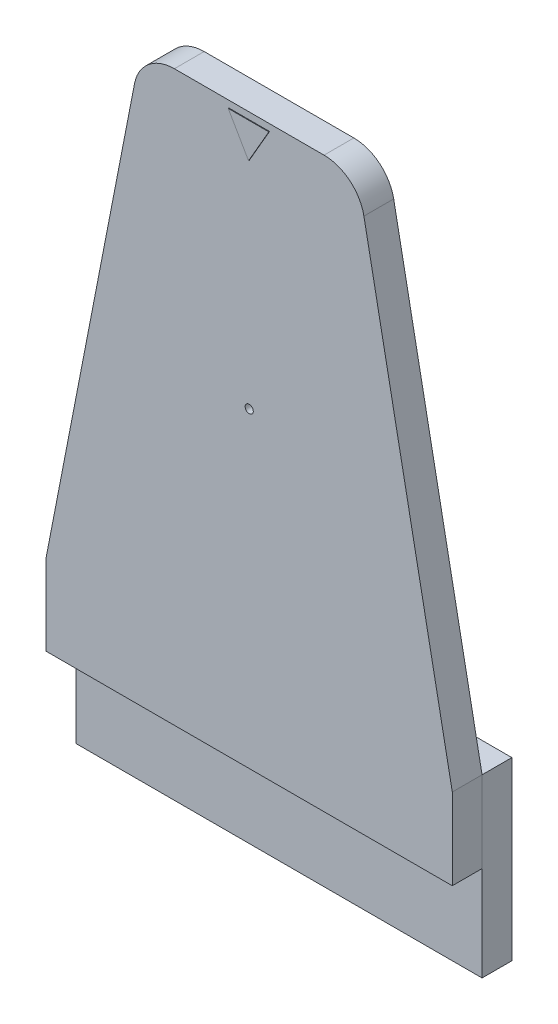
ISO-10303-21;
HEADER;
FILE_DESCRIPTION(('STEP AP214'),'2;1');
FILE_NAME('part.step','',(''),(''),'','','');
FILE_SCHEMA(('AUTOMOTIVE_DESIGN { 1 0 10303 214 1 1 1 1 }'));
ENDSEC;
DATA;
#1=APPLICATION_CONTEXT('core data for automotive mechanical design processes');
#2=APPLICATION_PROTOCOL_DEFINITION('international standard','automotive_design',2000,#1);
#3=PRODUCT_CONTEXT('',#1,'mechanical');
#4=PRODUCT('Part','Part','',(#3));
#5=PRODUCT_RELATED_PRODUCT_CATEGORY('part','',(#4));
#6=PRODUCT_DEFINITION_FORMATION('','',#4);
#7=PRODUCT_DEFINITION_CONTEXT('part definition',#1,'design');
#8=PRODUCT_DEFINITION('design','',#6,#7);
#9=PRODUCT_DEFINITION_SHAPE('','',#8);
#10=(LENGTH_UNIT() NAMED_UNIT(*) SI_UNIT(.MILLI.,.METRE.));
#11=(NAMED_UNIT(*) PLANE_ANGLE_UNIT() SI_UNIT($,.RADIAN.));
#12=(NAMED_UNIT(*) SI_UNIT($,.STERADIAN.) SOLID_ANGLE_UNIT());
#13=UNCERTAINTY_MEASURE_WITH_UNIT(LENGTH_MEASURE(1.E-05),#10,'distance_accuracy_value','');
#14=(GEOMETRIC_REPRESENTATION_CONTEXT(3) GLOBAL_UNCERTAINTY_ASSIGNED_CONTEXT((#13)) GLOBAL_UNIT_ASSIGNED_CONTEXT((#10,
#11,#12)) REPRESENTATION_CONTEXT('',''));
#15=CARTESIAN_POINT('',(0.,0.,0.));
#16=DIRECTION('',(0.,0.,1.));
#17=DIRECTION('',(1.,0.,0.));
#18=AXIS2_PLACEMENT_3D('',#15,#16,#17);
#19=CARTESIAN_POINT('',(0.,389.019237886467,22.5));
#20=DIRECTION('',(0.866025403784439,0.5,0.));
#21=DIRECTION('',(-0.5,0.866025403784439,0.));
#22=AXIS2_PLACEMENT_3D('',#19,#20,#21);
#23=PLANE('',#22);
#24=DIRECTION('',(0.5,-0.866025403784439,0.));
#25=VECTOR('',#24,1.);
#26=CARTESIAN_POINT('',(0.,389.019237886467,22.));
#27=LINE('',#26,#25);
#28=CARTESIAN_POINT('',(-15.0000000000001,415.,22.));
#29=VERTEX_POINT('',#28);
#30=CARTESIAN_POINT('',(0.,389.019237886467,22.));
#31=VERTEX_POINT('',#30);
#32=EDGE_CURVE('E96',#29,#31,#27,.T.);
#33=ORIENTED_EDGE('',*,*,#32,.T.);
#34=DIRECTION('',(0.,0.,-1.));
#35=VECTOR('',#34,1.);
#36=CARTESIAN_POINT('',(0.,389.019237886467,22.5));
#37=LINE('',#36,#35);
#38=CARTESIAN_POINT('',(0.,389.019237886467,22.5));
#39=VERTEX_POINT('',#38);
#40=EDGE_CURVE('E12',#39,#31,#37,.T.);
#41=ORIENTED_EDGE('',*,*,#40,.F.);
#42=DIRECTION('',(0.5,-0.866025403784439,0.));
#43=VECTOR('',#42,1.);
#44=CARTESIAN_POINT('',(0.,389.019237886467,22.5));
#45=LINE('',#44,#43);
#46=CARTESIAN_POINT('',(-15.0000000000001,415.,22.5));
#47=VERTEX_POINT('',#46);
#48=EDGE_CURVE('E89',#47,#39,#45,.T.);
#49=ORIENTED_EDGE('',*,*,#48,.F.);
#50=DIRECTION('',(0.,0.,-1.));
#51=VECTOR('',#50,1.);
#52=CARTESIAN_POINT('',(-15.0000000000001,415.,22.5));
#53=LINE('',#52,#51);
#54=EDGE_CURVE('E97',#47,#29,#53,.T.);
#55=ORIENTED_EDGE('',*,*,#54,.T.);
#56=EDGE_LOOP('',(#33,#41,#49,#55));
#57=FACE_BOUND('',#56,.T.);
#58=ADVANCED_FACE('F49',(#57),#23,.F.);
#59=CARTESIAN_POINT('',(14.9999999999999,415.,22.5));
#60=DIRECTION('',(-0.866025403784439,0.5,0.));
#61=DIRECTION('',(-0.5,-0.866025403784439,0.));
#62=AXIS2_PLACEMENT_3D('',#59,#60,#61);
#63=PLANE('',#62);
#64=DIRECTION('',(0.5,0.866025403784439,0.));
#65=VECTOR('',#64,1.);
#66=CARTESIAN_POINT('',(14.9999999999999,415.,22.));
#67=LINE('',#66,#65);
#68=CARTESIAN_POINT('',(14.9999999999999,415.,22.));
#69=VERTEX_POINT('',#68);
#70=EDGE_CURVE('E77',#31,#69,#67,.T.);
#71=ORIENTED_EDGE('',*,*,#70,.T.);
#72=DIRECTION('',(0.,0.,-1.));
#73=VECTOR('',#72,1.);
#74=CARTESIAN_POINT('',(14.9999999999999,415.,22.5));
#75=LINE('',#74,#73);
#76=CARTESIAN_POINT('',(14.9999999999999,415.,22.5));
#77=VERTEX_POINT('',#76);
#78=EDGE_CURVE('E57',#77,#69,#75,.T.);
#79=ORIENTED_EDGE('',*,*,#78,.F.);
#80=DIRECTION('',(0.5,0.866025403784439,0.));
#81=VECTOR('',#80,1.);
#82=CARTESIAN_POINT('',(14.9999999999999,415.,22.5));
#83=LINE('',#82,#81);
#84=EDGE_CURVE('E85',#39,#77,#83,.T.);
#85=ORIENTED_EDGE('',*,*,#84,.F.);
#86=ORIENTED_EDGE('',*,*,#40,.T.);
#87=EDGE_LOOP('',(#71,#79,#85,#86));
#88=FACE_BOUND('',#87,.T.);
#89=ADVANCED_FACE('F86',(#88),#63,.F.);
#90=CARTESIAN_POINT('',(-15.0000000000001,415.,22.5));
#91=DIRECTION('',(0.,-1.,0.));
#92=DIRECTION('',(0.,0.,-1.));
#93=AXIS2_PLACEMENT_3D('',#90,#91,#92);
#94=PLANE('',#93);
#95=DIRECTION('',(-1.,0.,0.));
#96=VECTOR('',#95,1.);
#97=CARTESIAN_POINT('',(-15.0000000000001,415.,22.));
#98=LINE('',#97,#96);
#99=EDGE_CURVE('E82',#69,#29,#98,.T.);
#100=ORIENTED_EDGE('',*,*,#99,.T.);
#101=ORIENTED_EDGE('',*,*,#54,.F.);
#102=DIRECTION('',(-1.,0.,0.));
#103=VECTOR('',#102,1.);
#104=CARTESIAN_POINT('',(-15.0000000000001,415.,22.5));
#105=LINE('',#104,#103);
#106=EDGE_CURVE('E65',#77,#47,#105,.T.);
#107=ORIENTED_EDGE('',*,*,#106,.F.);
#108=ORIENTED_EDGE('',*,*,#78,.T.);
#109=EDGE_LOOP('',(#100,#101,#107,#108));
#110=FACE_BOUND('',#109,.T.);
#111=ADVANCED_FACE('F104',(#110),#94,.F.);
#112=CARTESIAN_POINT('',(0.,0.,22.5));
#113=DIRECTION('',(0.,0.,-1.));
#114=DIRECTION('',(-1.,0.,0.));
#115=AXIS2_PLACEMENT_3D('',#112,#113,#114);
#116=PLANE('',#115);
#117=ORIENTED_EDGE('',*,*,#48,.T.);
#118=ORIENTED_EDGE('',*,*,#84,.T.);
#119=ORIENTED_EDGE('',*,*,#106,.T.);
#120=EDGE_LOOP('',(#117,#118,#119));
#121=FACE_BOUND('',#120,.T.);
#122=ADVANCED_FACE('F92',(#121),#116,.F.);
#123=CARTESIAN_POINT('',(0.,0.,22.));
#124=DIRECTION('',(0.,0.,-1.));
#125=DIRECTION('',(-1.,0.,0.));
#126=AXIS2_PLACEMENT_3D('',#123,#124,#125);
#127=PLANE('',#126);
#128=ORIENTED_EDGE('',*,*,#32,.F.);
#129=ORIENTED_EDGE('',*,*,#99,.F.);
#130=ORIENTED_EDGE('',*,*,#70,.F.);
#131=EDGE_LOOP('',(#128,#129,#130));
#132=FACE_BOUND('',#131,.T.);
#133=ADVANCED_FACE('F105',(#132),#127,.T.);
#134=CLOSED_SHELL('',(#58,#89,#111,#122,#133));
#135=MANIFOLD_SOLID_BREP('B2',#134);
#136=CARTESIAN_POINT('',(150.,60.,-22.));
#137=DIRECTION('',(-1.,0.,0.));
#138=DIRECTION('',(0.,-1.,0.));
#139=AXIS2_PLACEMENT_3D('',#136,#137,#138);
#140=PLANE('',#139);
#141=DIRECTION('',(0.,-1.,0.));
#142=VECTOR('',#141,1.);
#143=CARTESIAN_POINT('',(150.,60.,0.));
#144=LINE('',#143,#142);
#145=CARTESIAN_POINT('',(150.,60.,0.));
#146=VERTEX_POINT('',#145);
#147=CARTESIAN_POINT('',(150.,-70.,0.));
#148=VERTEX_POINT('',#147);
#149=EDGE_CURVE('E218',#146,#148,#144,.T.);
#150=ORIENTED_EDGE('',*,*,#149,.T.);
#151=DIRECTION('',(0.,0.,1.));
#152=VECTOR('',#151,1.);
#153=CARTESIAN_POINT('',(150.,-70.,-22.));
#154=LINE('',#153,#152);
#155=CARTESIAN_POINT('',(150.,-70.,-22.));
#156=VERTEX_POINT('',#155);
#157=EDGE_CURVE('E47',#156,#148,#154,.T.);
#158=ORIENTED_EDGE('',*,*,#157,.F.);
#159=DIRECTION('',(0.,-1.,0.));
#160=VECTOR('',#159,1.);
#161=CARTESIAN_POINT('',(150.,60.,-22.));
#162=LINE('',#161,#160);
#163=CARTESIAN_POINT('',(150.,60.,-22.));
#164=VERTEX_POINT('',#163);
#165=EDGE_CURVE('E206',#164,#156,#162,.T.);
#166=ORIENTED_EDGE('',*,*,#165,.F.);
#167=DIRECTION('',(0.,0.,1.));
#168=VECTOR('',#167,1.);
#169=CARTESIAN_POINT('',(150.,60.,-22.));
#170=LINE('',#169,#168);
#171=EDGE_CURVE('E214',#164,#146,#170,.T.);
#172=ORIENTED_EDGE('',*,*,#171,.T.);
#173=EDGE_LOOP('',(#150,#158,#166,#172));
#174=FACE_BOUND('',#173,.T.);
#175=ADVANCED_FACE('F155',(#174),#140,.F.);
#176=CARTESIAN_POINT('',(150.,-70.,-22.));
#177=DIRECTION('',(0.,1.,0.));
#178=DIRECTION('',(0.,0.,1.));
#179=AXIS2_PLACEMENT_3D('',#176,#177,#178);
#180=PLANE('',#179);
#181=DIRECTION('',(-1.,0.,0.));
#182=VECTOR('',#181,1.);
#183=CARTESIAN_POINT('',(150.,-70.,0.));
#184=LINE('',#183,#182);
#185=CARTESIAN_POINT('',(-150.,-70.,0.));
#186=VERTEX_POINT('',#185);
#187=EDGE_CURVE('E210',#148,#186,#184,.T.);
#188=ORIENTED_EDGE('',*,*,#187,.T.);
#189=DIRECTION('',(0.,0.,1.));
#190=VECTOR('',#189,1.);
#191=CARTESIAN_POINT('',(-150.,-70.,-22.));
#192=LINE('',#191,#190);
#193=CARTESIAN_POINT('',(-150.,-70.,-22.));
#194=VERTEX_POINT('',#193);
#195=EDGE_CURVE('E163',#194,#186,#192,.T.);
#196=ORIENTED_EDGE('',*,*,#195,.F.);
#197=DIRECTION('',(-1.,0.,0.));
#198=VECTOR('',#197,1.);
#199=CARTESIAN_POINT('',(150.,-70.,-22.));
#200=LINE('',#199,#198);
#201=EDGE_CURVE('E201',#156,#194,#200,.T.);
#202=ORIENTED_EDGE('',*,*,#201,.F.);
#203=ORIENTED_EDGE('',*,*,#157,.T.);
#204=EDGE_LOOP('',(#188,#196,#202,#203));
#205=FACE_BOUND('',#204,.T.);
#206=ADVANCED_FACE('F209',(#205),#180,.F.);
#207=CARTESIAN_POINT('',(-150.,60.,-22.));
#208=DIRECTION('',(1.,0.,0.));
#209=DIRECTION('',(0.,0.,-1.));
#210=AXIS2_PLACEMENT_3D('',#207,#208,#209);
#211=PLANE('',#210);
#212=DIRECTION('',(0.,1.,0.));
#213=VECTOR('',#212,1.);
#214=CARTESIAN_POINT('',(-150.,60.,0.));
#215=LINE('',#214,#213);
#216=CARTESIAN_POINT('',(-150.,60.,0.));
#217=VERTEX_POINT('',#216);
#218=EDGE_CURVE('E188',#186,#217,#215,.T.);
#219=ORIENTED_EDGE('',*,*,#218,.T.);
#220=DIRECTION('',(0.,0.,1.));
#221=VECTOR('',#220,1.);
#222=CARTESIAN_POINT('',(-150.,60.,-22.));
#223=LINE('',#222,#221);
#224=CARTESIAN_POINT('',(-150.,60.,-22.));
#225=VERTEX_POINT('',#224);
#226=EDGE_CURVE('E211',#225,#217,#223,.T.);
#227=ORIENTED_EDGE('',*,*,#226,.F.);
#228=DIRECTION('',(0.,1.,0.));
#229=VECTOR('',#228,1.);
#230=CARTESIAN_POINT('',(-150.,60.,-22.));
#231=LINE('',#230,#229);
#232=EDGE_CURVE('E204',#194,#225,#231,.T.);
#233=ORIENTED_EDGE('',*,*,#232,.F.);
#234=ORIENTED_EDGE('',*,*,#195,.T.);
#235=EDGE_LOOP('',(#219,#227,#233,#234));
#236=FACE_BOUND('',#235,.T.);
#237=ADVANCED_FACE('F212',(#236),#211,.F.);
#238=CARTESIAN_POINT('',(150.,60.,-22.));
#239=DIRECTION('',(0.,-1.,0.));
#240=DIRECTION('',(0.,0.,-1.));
#241=AXIS2_PLACEMENT_3D('',#238,#239,#240);
#242=PLANE('',#241);
#243=DIRECTION('',(1.,0.,0.));
#244=VECTOR('',#243,1.);
#245=CARTESIAN_POINT('',(150.,60.,0.));
#246=LINE('',#245,#244);
#247=EDGE_CURVE('E194',#217,#146,#246,.T.);
#248=ORIENTED_EDGE('',*,*,#247,.T.);
#249=ORIENTED_EDGE('',*,*,#171,.F.);
#250=DIRECTION('',(1.,0.,0.));
#251=VECTOR('',#250,1.);
#252=CARTESIAN_POINT('',(150.,60.,-22.));
#253=LINE('',#252,#251);
#254=EDGE_CURVE('E171',#225,#164,#253,.T.);
#255=ORIENTED_EDGE('',*,*,#254,.F.);
#256=ORIENTED_EDGE('',*,*,#226,.T.);
#257=EDGE_LOOP('',(#248,#249,#255,#256));
#258=FACE_BOUND('',#257,.T.);
#259=ADVANCED_FACE('F225',(#258),#242,.F.);
#260=CARTESIAN_POINT('',(0.,0.,-22.));
#261=DIRECTION('',(0.,0.,-1.));
#262=DIRECTION('',(-1.,0.,0.));
#263=AXIS2_PLACEMENT_3D('',#260,#261,#262);
#264=PLANE('',#263);
#265=ORIENTED_EDGE('',*,*,#165,.T.);
#266=ORIENTED_EDGE('',*,*,#201,.T.);
#267=ORIENTED_EDGE('',*,*,#232,.T.);
#268=ORIENTED_EDGE('',*,*,#254,.T.);
#269=EDGE_LOOP('',(#265,#266,#267,#268));
#270=FACE_BOUND('',#269,.T.);
#271=ADVANCED_FACE('F202',(#270),#264,.T.);
#272=CARTESIAN_POINT('',(0.,0.,0.));
#273=DIRECTION('',(0.,0.,-1.));
#274=DIRECTION('',(-1.,0.,0.));
#275=AXIS2_PLACEMENT_3D('',#272,#273,#274);
#276=PLANE('',#275);
#277=ORIENTED_EDGE('',*,*,#149,.F.);
#278=ORIENTED_EDGE('',*,*,#247,.F.);
#279=ORIENTED_EDGE('',*,*,#218,.F.);
#280=ORIENTED_EDGE('',*,*,#187,.F.);
#281=EDGE_LOOP('',(#277,#278,#279,#280));
#282=FACE_BOUND('',#281,.T.);
#283=ADVANCED_FACE('F228',(#282),#276,.F.);
#284=CLOSED_SHELL('',(#175,#206,#237,#259,#271,#283));
#285=MANIFOLD_SOLID_BREP('B6',#284);
#286=CARTESIAN_POINT('',(55.2714652985129,390.,22.));
#287=DIRECTION('',(0.,0.,1.));
#288=DIRECTION('',(1.,0.,0.));
#289=AXIS2_PLACEMENT_3D('',#286,#287,#288);
#290=PLANE('',#289);
#291=CARTESIAN_POINT('',(55.2714652985129,390.,22.));
#292=DIRECTION('',(0.,0.,1.));
#293=DIRECTION('',(1.,0.,0.));
#294=AXIS2_PLACEMENT_3D('',#291,#292,#293);
#295=CIRCLE('',#294,30.);
#296=CARTESIAN_POINT('',(84.7199269885704,395.726089773067,22.));
#297=VERTEX_POINT('',#296);
#298=CARTESIAN_POINT('',(55.2714652985129,420.,22.));
#299=VERTEX_POINT('',#298);
#300=EDGE_CURVE('E378',#297,#299,#295,.T.);
#301=ORIENTED_EDGE('',*,*,#300,.T.);
#302=DIRECTION('',(-1.,0.,0.));
#303=VECTOR('',#302,1.);
#304=CARTESIAN_POINT('',(-55.2714652985129,420.,22.));
#305=LINE('',#304,#303);
#306=CARTESIAN_POINT('',(-55.2714652985129,420.,22.));
#307=VERTEX_POINT('',#306);
#308=EDGE_CURVE('E326',#299,#307,#305,.T.);
#309=ORIENTED_EDGE('',*,*,#308,.T.);
#310=CARTESIAN_POINT('',(-55.2714652985129,390.,22.));
#311=DIRECTION('',(0.,0.,1.));
#312=DIRECTION('',(-1.,0.,0.));
#313=AXIS2_PLACEMENT_3D('',#310,#311,#312);
#314=CIRCLE('',#313,30.);
#315=CARTESIAN_POINT('',(-84.7199269885704,395.726089773067,22.));
#316=VERTEX_POINT('',#315);
#317=EDGE_CURVE('E393',#307,#316,#314,.T.);
#318=ORIENTED_EDGE('',*,*,#317,.T.);
#319=DIRECTION('',(-0.190869659102224,-0.981615389668581,0.));
#320=VECTOR('',#319,1.);
#321=CARTESIAN_POINT('',(-150.,60.,22.));
#322=LINE('',#321,#320);
#323=CARTESIAN_POINT('',(-150.,60.,22.));
#324=VERTEX_POINT('',#323);
#325=EDGE_CURVE('E406',#316,#324,#322,.T.);
#326=ORIENTED_EDGE('',*,*,#325,.T.);
#327=DIRECTION('',(0.,-1.,0.));
#328=VECTOR('',#327,1.);
#329=CARTESIAN_POINT('',(-150.,0.,22.));
#330=LINE('',#329,#328);
#331=CARTESIAN_POINT('',(-150.,0.,22.));
#332=VERTEX_POINT('',#331);
#333=EDGE_CURVE('E345',#324,#332,#330,.T.);
#334=ORIENTED_EDGE('',*,*,#333,.T.);
#335=DIRECTION('',(1.,0.,0.));
#336=VECTOR('',#335,1.);
#337=CARTESIAN_POINT('',(-150.,0.,22.));
#338=LINE('',#337,#336);
#339=CARTESIAN_POINT('',(150.,0.,22.));
#340=VERTEX_POINT('',#339);
#341=EDGE_CURVE('E339',#332,#340,#338,.T.);
#342=ORIENTED_EDGE('',*,*,#341,.T.);
#343=DIRECTION('',(0.,1.,0.));
#344=VECTOR('',#343,1.);
#345=CARTESIAN_POINT('',(150.,0.,22.));
#346=LINE('',#345,#344);
#347=CARTESIAN_POINT('',(150.,60.,22.));
#348=VERTEX_POINT('',#347);
#349=EDGE_CURVE('E343',#340,#348,#346,.T.);
#350=ORIENTED_EDGE('',*,*,#349,.T.);
#351=DIRECTION('',(-0.190869659102224,0.981615389668581,0.));
#352=VECTOR('',#351,1.);
#353=CARTESIAN_POINT('',(150.,60.,22.));
#354=LINE('',#353,#352);
#355=EDGE_CURVE('E283',#348,#297,#354,.T.);
#356=ORIENTED_EDGE('',*,*,#355,.T.);
#357=EDGE_LOOP('',(#301,#309,#318,#326,#334,#342,#350,#356));
#358=FACE_BOUND('',#357,.T.);
#359=CARTESIAN_POINT('',(0.,230.,22.));
#360=DIRECTION('',(0.,0.,1.));
#361=DIRECTION('',(1.,0.,0.));
#362=AXIS2_PLACEMENT_3D('',#359,#360,#361);
#363=CIRCLE('',#362,3.);
#364=CARTESIAN_POINT('',(3.,230.,22.));
#365=VERTEX_POINT('',#364);
#366=EDGE_CURVE('E367',#365,#365,#363,.T.);
#367=ORIENTED_EDGE('',*,*,#366,.F.);
#368=EDGE_LOOP('',(#367));
#369=FACE_BOUND('',#368,.T.);
#370=ADVANCED_FACE('F266',(#358,#369),#290,.T.);
#371=CARTESIAN_POINT('',(55.2714652985129,390.,0.));
#372=DIRECTION('',(0.,0.,1.));
#373=DIRECTION('',(1.,0.,0.));
#374=AXIS2_PLACEMENT_3D('',#371,#372,#373);
#375=PLANE('',#374);
#376=CARTESIAN_POINT('',(55.2714652985129,390.,0.));
#377=DIRECTION('',(0.,0.,1.));
#378=DIRECTION('',(1.,0.,0.));
#379=AXIS2_PLACEMENT_3D('',#376,#377,#378);
#380=CIRCLE('',#379,30.);
#381=CARTESIAN_POINT('',(84.7199269885704,395.726089773067,0.));
#382=VERTEX_POINT('',#381);
#383=CARTESIAN_POINT('',(55.2714652985129,420.,0.));
#384=VERTEX_POINT('',#383);
#385=EDGE_CURVE('E363',#382,#384,#380,.T.);
#386=ORIENTED_EDGE('',*,*,#385,.F.);
#387=DIRECTION('',(-0.190869659102224,0.981615389668581,0.));
#388=VECTOR('',#387,1.);
#389=CARTESIAN_POINT('',(150.,60.,0.));
#390=LINE('',#389,#388);
#391=CARTESIAN_POINT('',(150.,60.,0.));
#392=VERTEX_POINT('',#391);
#393=EDGE_CURVE('E318',#392,#382,#390,.T.);
#394=ORIENTED_EDGE('',*,*,#393,.F.);
#395=DIRECTION('',(0.,1.,0.));
#396=VECTOR('',#395,1.);
#397=CARTESIAN_POINT('',(150.,0.,0.));
#398=LINE('',#397,#396);
#399=CARTESIAN_POINT('',(150.,0.,0.));
#400=VERTEX_POINT('',#399);
#401=EDGE_CURVE('E312',#400,#392,#398,.T.);
#402=ORIENTED_EDGE('',*,*,#401,.F.);
#403=DIRECTION('',(1.,0.,0.));
#404=VECTOR('',#403,1.);
#405=CARTESIAN_POINT('',(-150.,0.,0.));
#406=LINE('',#405,#404);
#407=CARTESIAN_POINT('',(-150.,0.,0.));
#408=VERTEX_POINT('',#407);
#409=EDGE_CURVE('E353',#408,#400,#406,.T.);
#410=ORIENTED_EDGE('',*,*,#409,.F.);
#411=DIRECTION('',(0.,-1.,0.));
#412=VECTOR('',#411,1.);
#413=CARTESIAN_POINT('',(-150.,0.,0.));
#414=LINE('',#413,#412);
#415=CARTESIAN_POINT('',(-150.,60.,0.));
#416=VERTEX_POINT('',#415);
#417=EDGE_CURVE('E373',#416,#408,#414,.T.);
#418=ORIENTED_EDGE('',*,*,#417,.F.);
#419=DIRECTION('',(-0.190869659102224,-0.981615389668581,0.));
#420=VECTOR('',#419,1.);
#421=CARTESIAN_POINT('',(-150.,60.,0.));
#422=LINE('',#421,#420);
#423=CARTESIAN_POINT('',(-84.7199269885704,395.726089773067,0.));
#424=VERTEX_POINT('',#423);
#425=EDGE_CURVE('E371',#424,#416,#422,.T.);
#426=ORIENTED_EDGE('',*,*,#425,.F.);
#427=CARTESIAN_POINT('',(-55.2714652985129,390.,0.));
#428=DIRECTION('',(0.,0.,1.));
#429=DIRECTION('',(-1.,0.,0.));
#430=AXIS2_PLACEMENT_3D('',#427,#428,#429);
#431=CIRCLE('',#430,30.);
#432=CARTESIAN_POINT('',(-55.2714652985129,420.,0.));
#433=VERTEX_POINT('',#432);
#434=EDGE_CURVE('E369',#433,#424,#431,.T.);
#435=ORIENTED_EDGE('',*,*,#434,.F.);
#436=DIRECTION('',(-1.,0.,0.));
#437=VECTOR('',#436,1.);
#438=CARTESIAN_POINT('',(-55.2714652985129,420.,0.));
#439=LINE('',#438,#437);
#440=EDGE_CURVE('E366',#384,#433,#439,.T.);
#441=ORIENTED_EDGE('',*,*,#440,.F.);
#442=EDGE_LOOP('',(#386,#394,#402,#410,#418,#426,#435,#441));
#443=FACE_BOUND('',#442,.T.);
#444=CARTESIAN_POINT('',(0.,230.,0.));
#445=DIRECTION('',(0.,0.,1.));
#446=DIRECTION('',(1.,0.,0.));
#447=AXIS2_PLACEMENT_3D('',#444,#445,#446);
#448=CIRCLE('',#447,3.);
#449=CARTESIAN_POINT('',(3.,230.,0.));
#450=VERTEX_POINT('',#449);
#451=EDGE_CURVE('E412',#450,#450,#448,.T.);
#452=ORIENTED_EDGE('',*,*,#451,.T.);
#453=EDGE_LOOP('',(#452));
#454=FACE_BOUND('',#453,.T.);
#455=ADVANCED_FACE('F397',(#443,#454),#375,.F.);
#456=CARTESIAN_POINT('',(55.2714652985129,390.,22.));
#457=DIRECTION('',(0.,0.,-1.));
#458=DIRECTION('',(-1.,0.,0.));
#459=AXIS2_PLACEMENT_3D('',#456,#457,#458);
#460=CYLINDRICAL_SURFACE('',#459,30.);
#461=ORIENTED_EDGE('',*,*,#385,.T.);
#462=DIRECTION('',(0.,0.,-1.));
#463=VECTOR('',#462,1.);
#464=CARTESIAN_POINT('',(55.2714652985129,420.,22.));
#465=LINE('',#464,#463);
#466=EDGE_CURVE('E153',#299,#384,#465,.T.);
#467=ORIENTED_EDGE('',*,*,#466,.F.);
#468=ORIENTED_EDGE('',*,*,#300,.F.);
#469=DIRECTION('',(0.,0.,-1.));
#470=VECTOR('',#469,1.);
#471=CARTESIAN_POINT('',(84.7199269885704,395.726089773067,22.));
#472=LINE('',#471,#470);
#473=EDGE_CURVE('E359',#297,#382,#472,.T.);
#474=ORIENTED_EDGE('',*,*,#473,.T.);
#475=EDGE_LOOP('',(#461,#467,#468,#474));
#476=FACE_BOUND('',#475,.T.);
#477=ADVANCED_FACE('F268',(#476),#460,.T.);
#478=CARTESIAN_POINT('',(-55.2714652985129,420.,22.));
#479=DIRECTION('',(0.,-1.,0.));
#480=DIRECTION('',(0.,0.,-1.));
#481=AXIS2_PLACEMENT_3D('',#478,#479,#480);
#482=PLANE('',#481);
#483=ORIENTED_EDGE('',*,*,#440,.T.);
#484=DIRECTION('',(0.,0.,-1.));
#485=VECTOR('',#484,1.);
#486=CARTESIAN_POINT('',(-55.2714652985129,420.,22.));
#487=LINE('',#486,#485);
#488=EDGE_CURVE('E275',#307,#433,#487,.T.);
#489=ORIENTED_EDGE('',*,*,#488,.F.);
#490=ORIENTED_EDGE('',*,*,#308,.F.);
#491=ORIENTED_EDGE('',*,*,#466,.T.);
#492=EDGE_LOOP('',(#483,#489,#490,#491));
#493=FACE_BOUND('',#492,.T.);
#494=ADVANCED_FACE('F440',(#493),#482,.F.);
#495=CARTESIAN_POINT('',(-55.2714652985129,390.,22.));
#496=DIRECTION('',(0.,0.,-1.));
#497=DIRECTION('',(-1.,0.,0.));
#498=AXIS2_PLACEMENT_3D('',#495,#496,#497);
#499=CYLINDRICAL_SURFACE('',#498,30.);
#500=ORIENTED_EDGE('',*,*,#434,.T.);
#501=DIRECTION('',(0.,0.,-1.));
#502=VECTOR('',#501,1.);
#503=CARTESIAN_POINT('',(-84.7199269885704,395.726089773067,22.));
#504=LINE('',#503,#502);
#505=EDGE_CURVE('E385',#316,#424,#504,.T.);
#506=ORIENTED_EDGE('',*,*,#505,.F.);
#507=ORIENTED_EDGE('',*,*,#317,.F.);
#508=ORIENTED_EDGE('',*,*,#488,.T.);
#509=EDGE_LOOP('',(#500,#506,#507,#508));
#510=FACE_BOUND('',#509,.T.);
#511=ADVANCED_FACE('F391',(#510),#499,.T.);
#512=CARTESIAN_POINT('',(-150.,60.,22.));
#513=DIRECTION('',(0.981615389668581,-0.190869659102224,0.));
#514=DIRECTION('',(0.190869659102224,0.981615389668581,0.));
#515=AXIS2_PLACEMENT_3D('',#512,#513,#514);
#516=PLANE('',#515);
#517=ORIENTED_EDGE('',*,*,#425,.T.);
#518=DIRECTION('',(0.,0.,-1.));
#519=VECTOR('',#518,1.);
#520=CARTESIAN_POINT('',(-150.,60.,22.));
#521=LINE('',#520,#519);
#522=EDGE_CURVE('E382',#324,#416,#521,.T.);
#523=ORIENTED_EDGE('',*,*,#522,.F.);
#524=ORIENTED_EDGE('',*,*,#325,.F.);
#525=ORIENTED_EDGE('',*,*,#505,.T.);
#526=EDGE_LOOP('',(#517,#523,#524,#525));
#527=FACE_BOUND('',#526,.T.);
#528=ADVANCED_FACE('F402',(#527),#516,.F.);
#529=CARTESIAN_POINT('',(-150.,0.,22.));
#530=DIRECTION('',(1.,0.,0.));
#531=DIRECTION('',(0.,0.,-1.));
#532=AXIS2_PLACEMENT_3D('',#529,#530,#531);
#533=PLANE('',#532);
#534=ORIENTED_EDGE('',*,*,#417,.T.);
#535=DIRECTION('',(0.,0.,-1.));
#536=VECTOR('',#535,1.);
#537=CARTESIAN_POINT('',(-150.,0.,22.));
#538=LINE('',#537,#536);
#539=EDGE_CURVE('E354',#332,#408,#538,.T.);
#540=ORIENTED_EDGE('',*,*,#539,.F.);
#541=ORIENTED_EDGE('',*,*,#333,.F.);
#542=ORIENTED_EDGE('',*,*,#522,.T.);
#543=EDGE_LOOP('',(#534,#540,#541,#542));
#544=FACE_BOUND('',#543,.T.);
#545=ADVANCED_FACE('F405',(#544),#533,.F.);
#546=CARTESIAN_POINT('',(-150.,0.,22.));
#547=DIRECTION('',(0.,1.,0.));
#548=DIRECTION('',(0.,0.,1.));
#549=AXIS2_PLACEMENT_3D('',#546,#547,#548);
#550=PLANE('',#549);
#551=ORIENTED_EDGE('',*,*,#409,.T.);
#552=DIRECTION('',(0.,0.,-1.));
#553=VECTOR('',#552,1.);
#554=CARTESIAN_POINT('',(150.,0.,22.));
#555=LINE('',#554,#553);
#556=EDGE_CURVE('E350',#340,#400,#555,.T.);
#557=ORIENTED_EDGE('',*,*,#556,.F.);
#558=ORIENTED_EDGE('',*,*,#341,.F.);
#559=ORIENTED_EDGE('',*,*,#539,.T.);
#560=EDGE_LOOP('',(#551,#557,#558,#559));
#561=FACE_BOUND('',#560,.T.);
#562=ADVANCED_FACE('F351',(#561),#550,.F.);
#563=CARTESIAN_POINT('',(150.,0.,22.));
#564=DIRECTION('',(-1.,0.,0.));
#565=DIRECTION('',(0.,0.,1.));
#566=AXIS2_PLACEMENT_3D('',#563,#564,#565);
#567=PLANE('',#566);
#568=ORIENTED_EDGE('',*,*,#401,.T.);
#569=DIRECTION('',(0.,0.,-1.));
#570=VECTOR('',#569,1.);
#571=CARTESIAN_POINT('',(150.,60.,22.));
#572=LINE('',#571,#570);
#573=EDGE_CURVE('E355',#348,#392,#572,.T.);
#574=ORIENTED_EDGE('',*,*,#573,.F.);
#575=ORIENTED_EDGE('',*,*,#349,.F.);
#576=ORIENTED_EDGE('',*,*,#556,.T.);
#577=EDGE_LOOP('',(#568,#574,#575,#576));
#578=FACE_BOUND('',#577,.T.);
#579=ADVANCED_FACE('F357',(#578),#567,.F.);
#580=CARTESIAN_POINT('',(150.,60.,22.));
#581=DIRECTION('',(-0.981615389668581,-0.190869659102224,0.));
#582=DIRECTION('',(0.190869659102224,-0.981615389668581,0.));
#583=AXIS2_PLACEMENT_3D('',#580,#581,#582);
#584=PLANE('',#583);
#585=ORIENTED_EDGE('',*,*,#393,.T.);
#586=ORIENTED_EDGE('',*,*,#473,.F.);
#587=ORIENTED_EDGE('',*,*,#355,.F.);
#588=ORIENTED_EDGE('',*,*,#573,.T.);
#589=EDGE_LOOP('',(#585,#586,#587,#588));
#590=FACE_BOUND('',#589,.T.);
#591=ADVANCED_FACE('F428',(#590),#584,.F.);
#592=CARTESIAN_POINT('',(0.,230.,22.));
#593=DIRECTION('',(0.,0.,-1.));
#594=DIRECTION('',(-1.,0.,0.));
#595=AXIS2_PLACEMENT_3D('',#592,#593,#594);
#596=CYLINDRICAL_SURFACE('',#595,3.);
#597=ORIENTED_EDGE('',*,*,#366,.T.);
#598=EDGE_LOOP('',(#597));
#599=FACE_BOUND('',#598,.T.);
#600=ORIENTED_EDGE('',*,*,#451,.F.);
#601=EDGE_LOOP('',(#600));
#602=FACE_BOUND('',#601,.T.);
#603=ADVANCED_FACE('F418',(#599,#602),#596,.F.);
#604=CLOSED_SHELL('',(#370,#455,#477,#494,#511,#528,#545,#562,#579,#591,#603));
#605=MANIFOLD_SOLID_BREP('B41',#604);
#606=ADVANCED_BREP_SHAPE_REPRESENTATION('',(#18,#135,#285,#605),#14);
#607=SHAPE_DEFINITION_REPRESENTATION(#9,#606);
ENDSEC;
END-ISO-10303-21;
